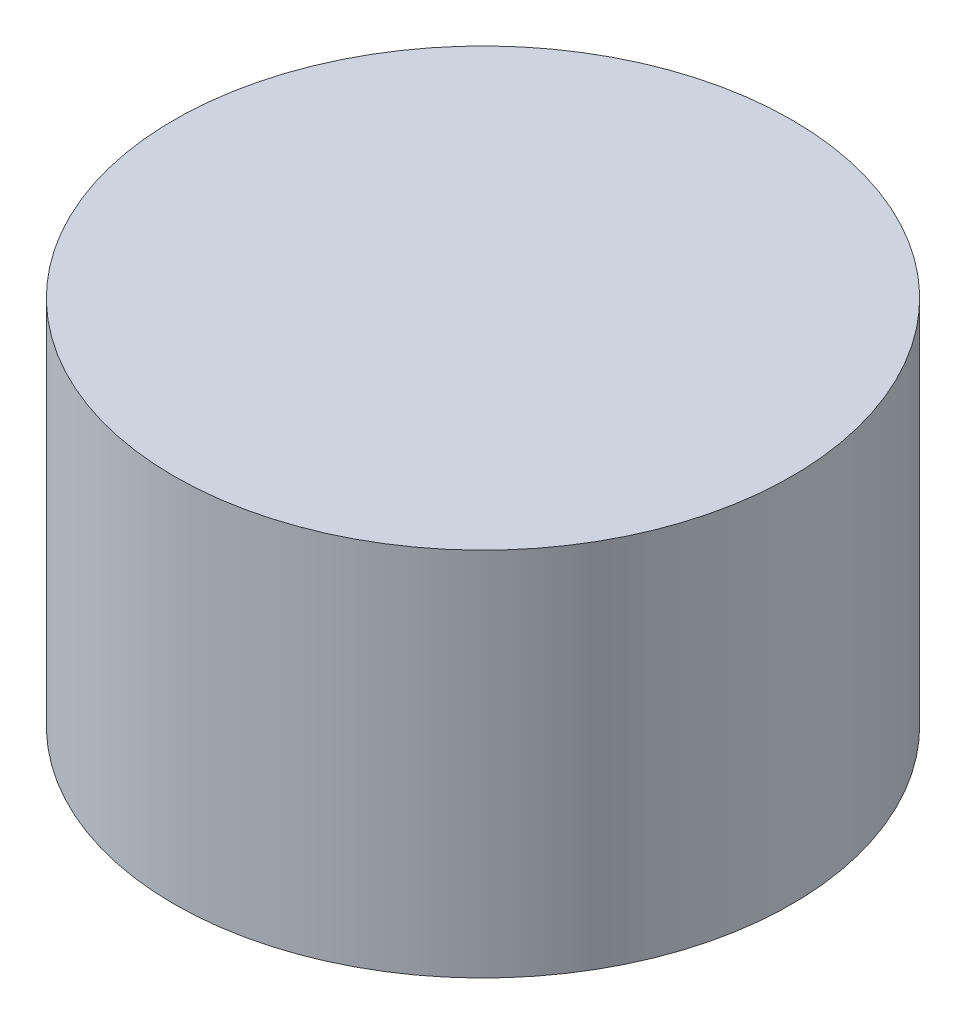
ISO-10303-21;
HEADER;
FILE_DESCRIPTION(('STEP AP214'),'2;1');
FILE_NAME('part.step','',(''),(''),'','','');
FILE_SCHEMA(('AUTOMOTIVE_DESIGN { 1 0 10303 214 1 1 1 1 }'));
ENDSEC;
DATA;
#1=APPLICATION_CONTEXT('core data for automotive mechanical design processes');
#2=APPLICATION_PROTOCOL_DEFINITION('international standard','automotive_design',2000,#1);
#3=PRODUCT_CONTEXT('',#1,'mechanical');
#4=PRODUCT('Part','Part','',(#3));
#5=PRODUCT_RELATED_PRODUCT_CATEGORY('part','',(#4));
#6=PRODUCT_DEFINITION_FORMATION('','',#4);
#7=PRODUCT_DEFINITION_CONTEXT('part definition',#1,'design');
#8=PRODUCT_DEFINITION('design','',#6,#7);
#9=PRODUCT_DEFINITION_SHAPE('','',#8);
#10=(LENGTH_UNIT() NAMED_UNIT(*) SI_UNIT(.MILLI.,.METRE.));
#11=(NAMED_UNIT(*) PLANE_ANGLE_UNIT() SI_UNIT($,.RADIAN.));
#12=(NAMED_UNIT(*) SI_UNIT($,.STERADIAN.) SOLID_ANGLE_UNIT());
#13=UNCERTAINTY_MEASURE_WITH_UNIT(LENGTH_MEASURE(1.E-05),#10,'distance_accuracy_value','');
#14=(GEOMETRIC_REPRESENTATION_CONTEXT(3) GLOBAL_UNCERTAINTY_ASSIGNED_CONTEXT((#13)) GLOBAL_UNIT_ASSIGNED_CONTEXT((#10,
#11,#12)) REPRESENTATION_CONTEXT('',''));
#15=CARTESIAN_POINT('',(0.,0.,0.));
#16=DIRECTION('',(0.,0.,1.));
#17=DIRECTION('',(1.,0.,0.));
#18=AXIS2_PLACEMENT_3D('',#15,#16,#17);
#19=CARTESIAN_POINT('',(0.,3.,0.));
#20=DIRECTION('',(0.,-1.,0.));
#21=DIRECTION('',(0.,0.,-1.));
#22=AXIS2_PLACEMENT_3D('',#19,#20,#21);
#23=CYLINDRICAL_SURFACE('',#22,2.5);
#24=CARTESIAN_POINT('',(0.,3.,0.));
#25=DIRECTION('',(0.,1.,0.));
#26=DIRECTION('',(0.,0.,1.));
#27=AXIS2_PLACEMENT_3D('',#24,#25,#26);
#28=CIRCLE('',#27,2.5);
#29=CARTESIAN_POINT('',(0.,3.,2.5));
#30=VERTEX_POINT('',#29);
#31=EDGE_CURVE('E10',#30,#30,#28,.T.);
#32=ORIENTED_EDGE('',*,*,#31,.F.);
#33=EDGE_LOOP('',(#32));
#34=FACE_BOUND('',#33,.T.);
#35=CARTESIAN_POINT('',(0.,0.,0.));
#36=DIRECTION('',(0.,1.,0.));
#37=DIRECTION('',(0.,0.,1.));
#38=AXIS2_PLACEMENT_3D('',#35,#36,#37);
#39=CIRCLE('',#38,2.5);
#40=CARTESIAN_POINT('',(0.,0.,2.5));
#41=VERTEX_POINT('',#40);
#42=EDGE_CURVE('E42',#41,#41,#39,.T.);
#43=ORIENTED_EDGE('',*,*,#42,.T.);
#44=EDGE_LOOP('',(#43));
#45=FACE_BOUND('',#44,.T.);
#46=ADVANCED_FACE('F39',(#34,#45),#23,.T.);
#47=CARTESIAN_POINT('',(0.,3.,0.));
#48=DIRECTION('',(0.,1.,0.));
#49=DIRECTION('',(0.,0.,1.));
#50=AXIS2_PLACEMENT_3D('',#47,#48,#49);
#51=PLANE('',#50);
#52=ORIENTED_EDGE('',*,*,#31,.T.);
#53=EDGE_LOOP('',(#52));
#54=FACE_BOUND('',#53,.T.);
#55=ADVANCED_FACE('F54',(#54),#51,.T.);
#56=CARTESIAN_POINT('',(0.,0.,0.));
#57=DIRECTION('',(0.,1.,0.));
#58=DIRECTION('',(0.,0.,1.));
#59=AXIS2_PLACEMENT_3D('',#56,#57,#58);
#60=PLANE('',#59);
#61=ORIENTED_EDGE('',*,*,#42,.F.);
#62=EDGE_LOOP('',(#61));
#63=FACE_BOUND('',#62,.T.);
#64=ADVANCED_FACE('F52',(#63),#60,.F.);
#65=CLOSED_SHELL('',(#46,#55,#64));
#66=MANIFOLD_SOLID_BREP('B2',#65);
#67=ADVANCED_BREP_SHAPE_REPRESENTATION('',(#18,#66),#14);
#68=SHAPE_DEFINITION_REPRESENTATION(#9,#67);
ENDSEC;
END-ISO-10303-21;
